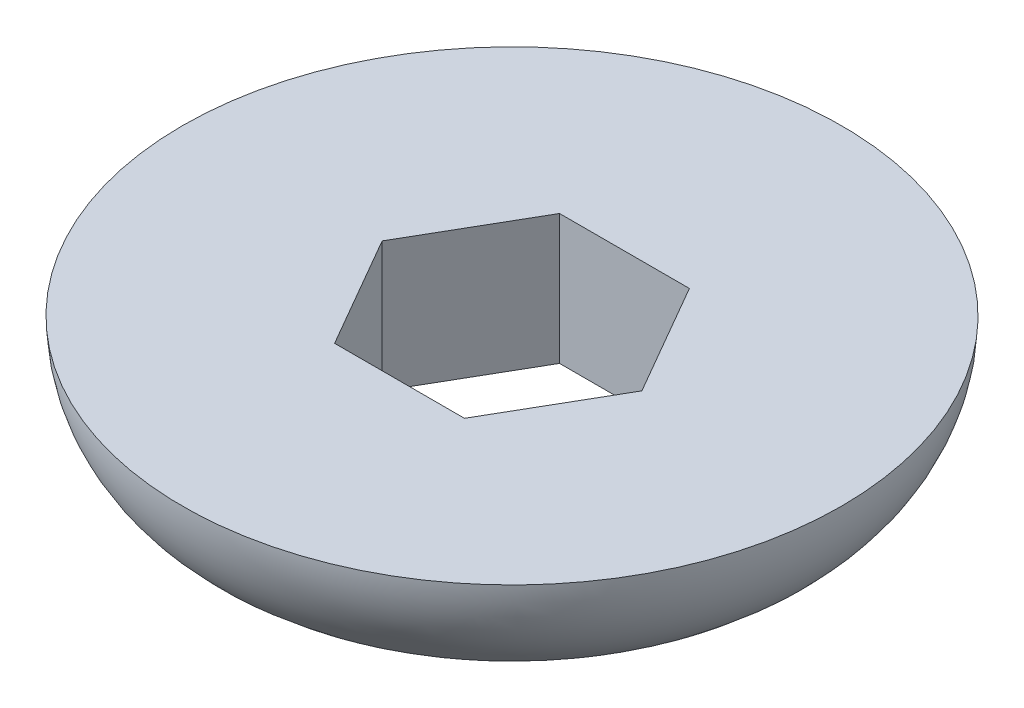
ISO-10303-21;
HEADER;
FILE_DESCRIPTION(('STEP AP214'),'2;1');
FILE_NAME('part.step','',(''),(''),'','','');
FILE_SCHEMA(('AUTOMOTIVE_DESIGN { 1 0 10303 214 1 1 1 1 }'));
ENDSEC;
DATA;
#1=APPLICATION_CONTEXT('core data for automotive mechanical design processes');
#2=APPLICATION_PROTOCOL_DEFINITION('international standard','automotive_design',2000,#1);
#3=PRODUCT_CONTEXT('',#1,'mechanical');
#4=PRODUCT('Part','Part','',(#3));
#5=PRODUCT_RELATED_PRODUCT_CATEGORY('part','',(#4));
#6=PRODUCT_DEFINITION_FORMATION('','',#4);
#7=PRODUCT_DEFINITION_CONTEXT('part definition',#1,'design');
#8=PRODUCT_DEFINITION('design','',#6,#7);
#9=PRODUCT_DEFINITION_SHAPE('','',#8);
#10=(LENGTH_UNIT() NAMED_UNIT(*) SI_UNIT(.MILLI.,.METRE.));
#11=(NAMED_UNIT(*) PLANE_ANGLE_UNIT() SI_UNIT($,.RADIAN.));
#12=(NAMED_UNIT(*) SI_UNIT($,.STERADIAN.) SOLID_ANGLE_UNIT());
#13=UNCERTAINTY_MEASURE_WITH_UNIT(LENGTH_MEASURE(1.E-05),#10,'distance_accuracy_value','');
#14=(GEOMETRIC_REPRESENTATION_CONTEXT(3) GLOBAL_UNCERTAINTY_ASSIGNED_CONTEXT((#13)) GLOBAL_UNIT_ASSIGNED_CONTEXT((#10,
#11,#12)) REPRESENTATION_CONTEXT('',''));
#15=CARTESIAN_POINT('',(0.,0.,0.));
#16=DIRECTION('',(0.,0.,1.));
#17=DIRECTION('',(1.,0.,0.));
#18=AXIS2_PLACEMENT_3D('',#15,#16,#17);
#19=CARTESIAN_POINT('',(10.1511691278652,4.,0.));
#20=DIRECTION('',(0.,-1.,0.));
#21=DIRECTION('',(1.,0.,0.));
#22=AXIS2_PLACEMENT_3D('',#19,#20,#21);
#23=PLANE('',#22);
#24=DIRECTION('',(1.,0.,0.));
#25=VECTOR('',#24,1.);
#26=CARTESIAN_POINT('',(10.1511691278652,4.,-3.46410161513775));
#27=LINE('',#26,#25);
#28=CARTESIAN_POINT('',(-2.,4.,-3.46410161513775));
#29=VERTEX_POINT('',#28);
#30=CARTESIAN_POINT('',(2.,4.,-3.46410161513775));
#31=VERTEX_POINT('',#30);
#32=EDGE_CURVE('E155',#29,#31,#27,.T.);
#33=ORIENTED_EDGE('',*,*,#32,.T.);
#34=DIRECTION('',(0.5,0.,0.866025403784439));
#35=VECTOR('',#34,1.);
#36=CARTESIAN_POINT('',(5.53779228196629,4.,2.6635343638529));
#37=LINE('',#36,#35);
#38=CARTESIAN_POINT('',(4.,4.,0.));
#39=VERTEX_POINT('',#38);
#40=EDGE_CURVE('E159',#31,#39,#37,.T.);
#41=ORIENTED_EDGE('',*,*,#40,.T.);
#42=DIRECTION('',(-0.5,0.,0.866025403784439));
#43=VECTOR('',#42,1.);
#44=CARTESIAN_POINT('',(5.53779228196629,4.,-2.6635343638529));
#45=LINE('',#44,#43);
#46=CARTESIAN_POINT('',(2.,4.,3.46410161513775));
#47=VERTEX_POINT('',#46);
#48=EDGE_CURVE('E132',#39,#47,#45,.T.);
#49=ORIENTED_EDGE('',*,*,#48,.T.);
#50=DIRECTION('',(-1.,0.,0.));
#51=VECTOR('',#50,1.);
#52=CARTESIAN_POINT('',(10.1511691278652,4.,3.46410161513776));
#53=LINE('',#52,#51);
#54=CARTESIAN_POINT('',(-2.,4.,3.46410161513775));
#55=VERTEX_POINT('',#54);
#56=EDGE_CURVE('E98',#47,#55,#53,.T.);
#57=ORIENTED_EDGE('',*,*,#56,.T.);
#58=DIRECTION('',(-0.5,0.,-0.866025403784439));
#59=VECTOR('',#58,1.);
#60=CARTESIAN_POINT('',(-0.462207718033715,4.,6.12763597899065));
#61=LINE('',#60,#59);
#62=CARTESIAN_POINT('',(-4.,4.,0.));
#63=VERTEX_POINT('',#62);
#64=EDGE_CURVE('E147',#55,#63,#61,.T.);
#65=ORIENTED_EDGE('',*,*,#64,.T.);
#66=DIRECTION('',(0.5,0.,-0.866025403784439));
#67=VECTOR('',#66,1.);
#68=CARTESIAN_POINT('',(-0.462207718033708,4.,-6.12763597899066));
#69=LINE('',#68,#67);
#70=EDGE_CURVE('E151',#63,#29,#69,.T.);
#71=ORIENTED_EDGE('',*,*,#70,.T.);
#72=EDGE_LOOP('',(#33,#41,#49,#57,#65,#71));
#73=FACE_BOUND('',#72,.T.);
#74=CARTESIAN_POINT('',(0.,4.,0.));
#75=DIRECTION('',(0.,1.,0.));
#76=DIRECTION('',(-1.,0.,0.));
#77=AXIS2_PLACEMENT_3D('',#74,#75,#76);
#78=CIRCLE('',#77,10.1511691278652);
#79=CARTESIAN_POINT('',(-10.1511691278652,4.,0.));
#80=VERTEX_POINT('',#79);
#81=EDGE_CURVE('E11',#80,#80,#78,.T.);
#82=ORIENTED_EDGE('',*,*,#81,.T.);
#83=EDGE_LOOP('',(#82));
#84=FACE_BOUND('',#83,.T.);
#85=ADVANCED_FACE('F39',(#73,#84),#23,.F.);
#86=CARTESIAN_POINT('',(0.,4.07558456393258,0.));
#87=DIRECTION('',(0.,1.,0.));
#88=DIRECTION('',(-1.,0.,0.));
#89=AXIS2_PLACEMENT_3D('',#86,#87,#88);
#90=TOROIDAL_SURFACE('',#89,6.07558456393258,4.07628538795684);
#91=ORIENTED_EDGE('',*,*,#81,.F.);
#92=EDGE_LOOP('',(#91));
#93=FACE_BOUND('',#92,.T.);
#94=CARTESIAN_POINT('',(0.,0.,0.));
#95=DIRECTION('',(0.,1.,0.));
#96=DIRECTION('',(-1.,0.,0.));
#97=AXIS2_PLACEMENT_3D('',#94,#95,#96);
#98=CIRCLE('',#97,6.);
#99=CARTESIAN_POINT('',(-6.,0.,0.));
#100=VERTEX_POINT('',#99);
#101=EDGE_CURVE('E47',#100,#100,#98,.T.);
#102=ORIENTED_EDGE('',*,*,#101,.T.);
#103=EDGE_LOOP('',(#102));
#104=FACE_BOUND('',#103,.T.);
#105=ADVANCED_FACE('F166',(#93,#104),#90,.T.);
#106=CARTESIAN_POINT('',(0.,0.,0.));
#107=DIRECTION('',(0.,1.,0.));
#108=DIRECTION('',(-1.,0.,0.));
#109=AXIS2_PLACEMENT_3D('',#106,#107,#108);
#110=PLANE('',#109);
#111=DIRECTION('',(-0.5,0.,0.866025403784439));
#112=VECTOR('',#111,1.);
#113=CARTESIAN_POINT('',(4.,0.,0.));
#114=LINE('',#113,#112);
#115=CARTESIAN_POINT('',(4.,0.,0.));
#116=VERTEX_POINT('',#115);
#117=CARTESIAN_POINT('',(2.,0.,3.46410161513775));
#118=VERTEX_POINT('',#117);
#119=EDGE_CURVE('E105',#116,#118,#114,.T.);
#120=ORIENTED_EDGE('',*,*,#119,.F.);
#121=DIRECTION('',(0.5,0.,0.866025403784439));
#122=VECTOR('',#121,1.);
#123=CARTESIAN_POINT('',(2.,0.,-3.46410161513775));
#124=LINE('',#123,#122);
#125=CARTESIAN_POINT('',(2.,0.,-3.46410161513775));
#126=VERTEX_POINT('',#125);
#127=EDGE_CURVE('E62',#126,#116,#124,.T.);
#128=ORIENTED_EDGE('',*,*,#127,.F.);
#129=DIRECTION('',(1.,0.,0.));
#130=VECTOR('',#129,1.);
#131=CARTESIAN_POINT('',(-2.,0.,-3.46410161513775));
#132=LINE('',#131,#130);
#133=CARTESIAN_POINT('',(-2.,0.,-3.46410161513775));
#134=VERTEX_POINT('',#133);
#135=EDGE_CURVE('E125',#134,#126,#132,.T.);
#136=ORIENTED_EDGE('',*,*,#135,.F.);
#137=DIRECTION('',(0.5,0.,-0.866025403784439));
#138=VECTOR('',#137,1.);
#139=CARTESIAN_POINT('',(-4.,0.,0.));
#140=LINE('',#139,#138);
#141=CARTESIAN_POINT('',(-4.,0.,0.));
#142=VERTEX_POINT('',#141);
#143=EDGE_CURVE('E118',#142,#134,#140,.T.);
#144=ORIENTED_EDGE('',*,*,#143,.F.);
#145=DIRECTION('',(-0.5,0.,-0.866025403784439));
#146=VECTOR('',#145,1.);
#147=CARTESIAN_POINT('',(-2.,0.,3.46410161513775));
#148=LINE('',#147,#146);
#149=CARTESIAN_POINT('',(-2.,0.,3.46410161513775));
#150=VERTEX_POINT('',#149);
#151=EDGE_CURVE('E114',#150,#142,#148,.T.);
#152=ORIENTED_EDGE('',*,*,#151,.F.);
#153=DIRECTION('',(-1.,0.,0.));
#154=VECTOR('',#153,1.);
#155=CARTESIAN_POINT('',(2.,0.,3.46410161513775));
#156=LINE('',#155,#154);
#157=EDGE_CURVE('E95',#118,#150,#156,.T.);
#158=ORIENTED_EDGE('',*,*,#157,.F.);
#159=EDGE_LOOP('',(#120,#128,#136,#144,#152,#158));
#160=FACE_BOUND('',#159,.T.);
#161=ORIENTED_EDGE('',*,*,#101,.F.);
#162=EDGE_LOOP('',(#161));
#163=FACE_BOUND('',#162,.T.);
#164=ADVANCED_FACE('F110',(#160,#163),#110,.F.);
#165=CARTESIAN_POINT('',(2.,4.8,-3.46410161513775));
#166=DIRECTION('',(0.866025403784439,0.,-0.5));
#167=DIRECTION('',(-0.5,0.,-0.866025403784439));
#168=AXIS2_PLACEMENT_3D('',#165,#166,#167);
#169=PLANE('',#168);
#170=DIRECTION('',(0.,-1.,0.));
#171=VECTOR('',#170,1.);
#172=CARTESIAN_POINT('',(2.,4.8,-3.46410161513775));
#173=LINE('',#172,#171);
#174=EDGE_CURVE('E129',#31,#126,#173,.T.);
#175=ORIENTED_EDGE('',*,*,#174,.T.);
#176=ORIENTED_EDGE('',*,*,#127,.T.);
#177=DIRECTION('',(0.,-1.,0.));
#178=VECTOR('',#177,1.);
#179=CARTESIAN_POINT('',(4.,4.8,0.));
#180=LINE('',#179,#178);
#181=EDGE_CURVE('E102',#39,#116,#180,.T.);
#182=ORIENTED_EDGE('',*,*,#181,.F.);
#183=ORIENTED_EDGE('',*,*,#40,.F.);
#184=EDGE_LOOP('',(#175,#176,#182,#183));
#185=FACE_BOUND('',#184,.T.);
#186=ADVANCED_FACE('F168',(#185),#169,.F.);
#187=CARTESIAN_POINT('',(-2.,4.8,-3.46410161513775));
#188=DIRECTION('',(0.,0.,-1.));
#189=DIRECTION('',(-1.,0.,0.));
#190=AXIS2_PLACEMENT_3D('',#187,#188,#189);
#191=PLANE('',#190);
#192=DIRECTION('',(0.,-1.,0.));
#193=VECTOR('',#192,1.);
#194=CARTESIAN_POINT('',(-2.,4.8,-3.46410161513775));
#195=LINE('',#194,#193);
#196=EDGE_CURVE('E133',#29,#134,#195,.T.);
#197=ORIENTED_EDGE('',*,*,#196,.T.);
#198=ORIENTED_EDGE('',*,*,#135,.T.);
#199=ORIENTED_EDGE('',*,*,#174,.F.);
#200=ORIENTED_EDGE('',*,*,#32,.F.);
#201=EDGE_LOOP('',(#197,#198,#199,#200));
#202=FACE_BOUND('',#201,.T.);
#203=ADVANCED_FACE('F174',(#202),#191,.F.);
#204=CARTESIAN_POINT('',(-4.,4.8,0.));
#205=DIRECTION('',(-0.866025403784439,0.,-0.5));
#206=DIRECTION('',(-0.5,0.,0.866025403784439));
#207=AXIS2_PLACEMENT_3D('',#204,#205,#206);
#208=PLANE('',#207);
#209=DIRECTION('',(0.,-1.,0.));
#210=VECTOR('',#209,1.);
#211=CARTESIAN_POINT('',(-4.,4.8,0.));
#212=LINE('',#211,#210);
#213=EDGE_CURVE('E136',#63,#142,#212,.T.);
#214=ORIENTED_EDGE('',*,*,#213,.T.);
#215=ORIENTED_EDGE('',*,*,#143,.T.);
#216=ORIENTED_EDGE('',*,*,#196,.F.);
#217=ORIENTED_EDGE('',*,*,#70,.F.);
#218=EDGE_LOOP('',(#214,#215,#216,#217));
#219=FACE_BOUND('',#218,.T.);
#220=ADVANCED_FACE('F187',(#219),#208,.F.);
#221=CARTESIAN_POINT('',(-2.,4.8,3.46410161513775));
#222=DIRECTION('',(-0.866025403784439,0.,0.5));
#223=DIRECTION('',(0.5,0.,0.866025403784439));
#224=AXIS2_PLACEMENT_3D('',#221,#222,#223);
#225=PLANE('',#224);
#226=DIRECTION('',(0.,-1.,0.));
#227=VECTOR('',#226,1.);
#228=CARTESIAN_POINT('',(-2.,4.8,3.46410161513775));
#229=LINE('',#228,#227);
#230=EDGE_CURVE('E101',#55,#150,#229,.T.);
#231=ORIENTED_EDGE('',*,*,#230,.T.);
#232=ORIENTED_EDGE('',*,*,#151,.T.);
#233=ORIENTED_EDGE('',*,*,#213,.F.);
#234=ORIENTED_EDGE('',*,*,#64,.F.);
#235=EDGE_LOOP('',(#231,#232,#233,#234));
#236=FACE_BOUND('',#235,.T.);
#237=ADVANCED_FACE('F192',(#236),#225,.F.);
#238=CARTESIAN_POINT('',(2.,4.8,3.46410161513775));
#239=DIRECTION('',(0.,0.,1.));
#240=DIRECTION('',(1.,0.,0.));
#241=AXIS2_PLACEMENT_3D('',#238,#239,#240);
#242=PLANE('',#241);
#243=DIRECTION('',(0.,-1.,0.));
#244=VECTOR('',#243,1.);
#245=CARTESIAN_POINT('',(2.,4.8,3.46410161513775));
#246=LINE('',#245,#244);
#247=EDGE_CURVE('E54',#47,#118,#246,.T.);
#248=ORIENTED_EDGE('',*,*,#247,.T.);
#249=ORIENTED_EDGE('',*,*,#157,.T.);
#250=ORIENTED_EDGE('',*,*,#230,.F.);
#251=ORIENTED_EDGE('',*,*,#56,.F.);
#252=EDGE_LOOP('',(#248,#249,#250,#251));
#253=FACE_BOUND('',#252,.T.);
#254=ADVANCED_FACE('F92',(#253),#242,.F.);
#255=CARTESIAN_POINT('',(4.,4.8,0.));
#256=DIRECTION('',(0.866025403784439,0.,0.5));
#257=DIRECTION('',(0.5,0.,-0.866025403784439));
#258=AXIS2_PLACEMENT_3D('',#255,#256,#257);
#259=PLANE('',#258);
#260=ORIENTED_EDGE('',*,*,#181,.T.);
#261=ORIENTED_EDGE('',*,*,#119,.T.);
#262=ORIENTED_EDGE('',*,*,#247,.F.);
#263=ORIENTED_EDGE('',*,*,#48,.F.);
#264=EDGE_LOOP('',(#260,#261,#262,#263));
#265=FACE_BOUND('',#264,.T.);
#266=ADVANCED_FACE('F106',(#265),#259,.F.);
#267=CLOSED_SHELL('',(#85,#105,#164,#186,#203,#220,#237,#254,#266));
#268=MANIFOLD_SOLID_BREP('B2',#267);
#269=ADVANCED_BREP_SHAPE_REPRESENTATION('',(#18,#268),#14);
#270=SHAPE_DEFINITION_REPRESENTATION(#9,#269);
ENDSEC;
END-ISO-10303-21;
